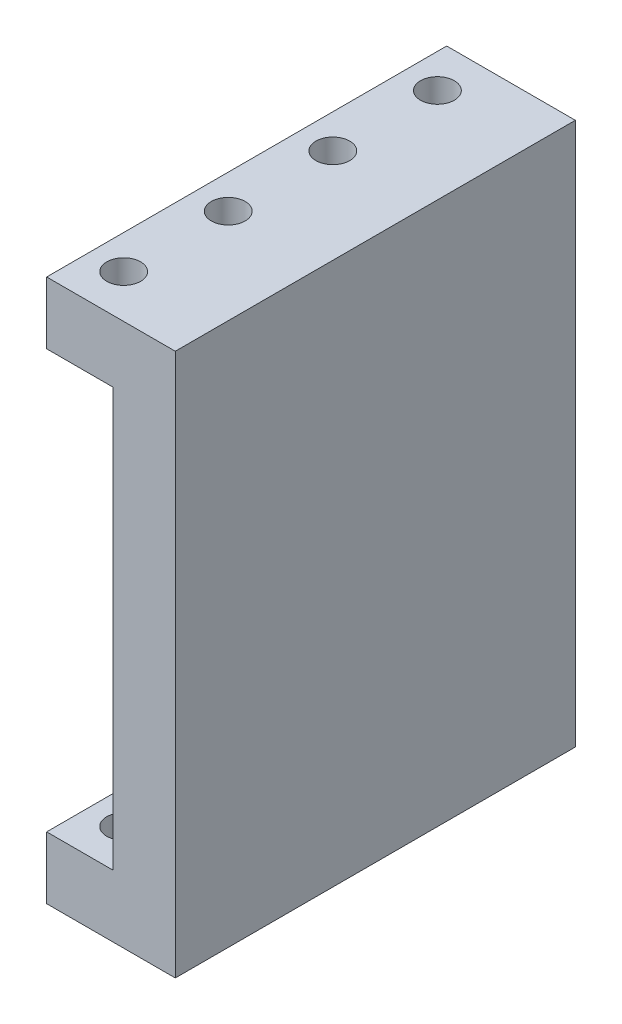
ISO-10303-21;
HEADER;
FILE_DESCRIPTION(('STEP AP214'),'2;1');
FILE_NAME('part.step','',(''),(''),'','','');
FILE_SCHEMA(('AUTOMOTIVE_DESIGN { 1 0 10303 214 1 1 1 1 }'));
ENDSEC;
DATA;
#1=APPLICATION_CONTEXT('core data for automotive mechanical design processes');
#2=APPLICATION_PROTOCOL_DEFINITION('international standard','automotive_design',2000,#1);
#3=PRODUCT_CONTEXT('',#1,'mechanical');
#4=PRODUCT('Part','Part','',(#3));
#5=PRODUCT_RELATED_PRODUCT_CATEGORY('part','',(#4));
#6=PRODUCT_DEFINITION_FORMATION('','',#4);
#7=PRODUCT_DEFINITION_CONTEXT('part definition',#1,'design');
#8=PRODUCT_DEFINITION('design','',#6,#7);
#9=PRODUCT_DEFINITION_SHAPE('','',#8);
#10=(LENGTH_UNIT() NAMED_UNIT(*) SI_UNIT(.MILLI.,.METRE.));
#11=(NAMED_UNIT(*) PLANE_ANGLE_UNIT() SI_UNIT($,.RADIAN.));
#12=(NAMED_UNIT(*) SI_UNIT($,.STERADIAN.) SOLID_ANGLE_UNIT());
#13=UNCERTAINTY_MEASURE_WITH_UNIT(LENGTH_MEASURE(1.E-05),#10,'distance_accuracy_value','');
#14=(GEOMETRIC_REPRESENTATION_CONTEXT(3) GLOBAL_UNCERTAINTY_ASSIGNED_CONTEXT((#13)) GLOBAL_UNIT_ASSIGNED_CONTEXT((#10,
#11,#12)) REPRESENTATION_CONTEXT('',''));
#15=CARTESIAN_POINT('',(0.,0.,0.));
#16=DIRECTION('',(0.,0.,1.));
#17=DIRECTION('',(1.,0.,0.));
#18=AXIS2_PLACEMENT_3D('',#15,#16,#17);
#19=CARTESIAN_POINT('',(5.08,0.,30.607));
#20=DIRECTION('',(-1.,0.,0.));
#21=DIRECTION('',(0.,-1.,0.));
#22=AXIS2_PLACEMENT_3D('',#19,#20,#21);
#23=PLANE('',#22);
#24=DIRECTION('',(0.,1.,0.));
#25=VECTOR('',#24,1.);
#26=CARTESIAN_POINT('',(5.08,0.,0.));
#27=LINE('',#26,#25);
#28=CARTESIAN_POINT('',(5.08,-41.529,0.));
#29=VERTEX_POINT('',#28);
#30=CARTESIAN_POINT('',(5.08,0.,0.));
#31=VERTEX_POINT('',#30);
#32=EDGE_CURVE('E130',#29,#31,#27,.T.);
#33=ORIENTED_EDGE('',*,*,#32,.T.);
#34=DIRECTION('',(0.,0.,-1.));
#35=VECTOR('',#34,1.);
#36=CARTESIAN_POINT('',(5.08,0.,30.607));
#37=LINE('',#36,#35);
#38=CARTESIAN_POINT('',(5.08,0.,30.607));
#39=VERTEX_POINT('',#38);
#40=EDGE_CURVE('E11',#39,#31,#37,.T.);
#41=ORIENTED_EDGE('',*,*,#40,.F.);
#42=DIRECTION('',(0.,1.,0.));
#43=VECTOR('',#42,1.);
#44=CARTESIAN_POINT('',(5.08,0.,30.607));
#45=LINE('',#44,#43);
#46=CARTESIAN_POINT('',(5.08,-41.529,30.607));
#47=VERTEX_POINT('',#46);
#48=EDGE_CURVE('E145',#47,#39,#45,.T.);
#49=ORIENTED_EDGE('',*,*,#48,.F.);
#50=DIRECTION('',(0.,0.,-1.));
#51=VECTOR('',#50,1.);
#52=CARTESIAN_POINT('',(5.08,-41.529,30.607));
#53=LINE('',#52,#51);
#54=EDGE_CURVE('E126',#47,#29,#53,.T.);
#55=ORIENTED_EDGE('',*,*,#54,.T.);
#56=EDGE_LOOP('',(#33,#41,#49,#55));
#57=FACE_BOUND('',#56,.T.);
#58=ADVANCED_FACE('F34',(#57),#23,.F.);
#59=CARTESIAN_POINT('',(-4.7625,0.,30.607));
#60=DIRECTION('',(0.,-1.,0.));
#61=DIRECTION('',(0.,0.,-1.));
#62=AXIS2_PLACEMENT_3D('',#59,#60,#61);
#63=PLANE('',#62);
#64=CARTESIAN_POINT('',(-2.1717,0.,11.303));
#65=DIRECTION('',(0.,1.,0.));
#66=DIRECTION('',(0.,0.,-1.));
#67=AXIS2_PLACEMENT_3D('',#64,#65,#66);
#68=CIRCLE('',#67,1.2954);
#69=CARTESIAN_POINT('',(-2.1717,0.,10.0076));
#70=VERTEX_POINT('',#69);
#71=EDGE_CURVE('E220',#70,#70,#68,.T.);
#72=ORIENTED_EDGE('',*,*,#71,.F.);
#73=EDGE_LOOP('',(#72));
#74=FACE_BOUND('',#73,.T.);
#75=CARTESIAN_POINT('',(-2.1717,0.,3.302));
#76=DIRECTION('',(0.,1.,0.));
#77=DIRECTION('',(0.,0.,-1.));
#78=AXIS2_PLACEMENT_3D('',#75,#76,#77);
#79=CIRCLE('',#78,1.2954);
#80=CARTESIAN_POINT('',(-2.1717,0.,2.0066));
#81=VERTEX_POINT('',#80);
#82=EDGE_CURVE('E208',#81,#81,#79,.T.);
#83=ORIENTED_EDGE('',*,*,#82,.F.);
#84=EDGE_LOOP('',(#83));
#85=FACE_BOUND('',#84,.T.);
#86=CARTESIAN_POINT('',(-2.1717,0.,19.304));
#87=DIRECTION('',(0.,1.,0.));
#88=DIRECTION('',(0.,0.,1.));
#89=AXIS2_PLACEMENT_3D('',#86,#87,#88);
#90=CIRCLE('',#89,1.2954);
#91=CARTESIAN_POINT('',(-2.1717,0.,20.5994));
#92=VERTEX_POINT('',#91);
#93=EDGE_CURVE('E196',#92,#92,#90,.T.);
#94=ORIENTED_EDGE('',*,*,#93,.F.);
#95=EDGE_LOOP('',(#94));
#96=FACE_BOUND('',#95,.T.);
#97=CARTESIAN_POINT('',(-2.1717,0.,27.305));
#98=DIRECTION('',(0.,1.,0.));
#99=DIRECTION('',(0.,0.,1.));
#100=AXIS2_PLACEMENT_3D('',#97,#98,#99);
#101=CIRCLE('',#100,1.2954);
#102=CARTESIAN_POINT('',(-2.1717,0.,28.6004));
#103=VERTEX_POINT('',#102);
#104=EDGE_CURVE('E184',#103,#103,#101,.T.);
#105=ORIENTED_EDGE('',*,*,#104,.F.);
#106=EDGE_LOOP('',(#105));
#107=FACE_BOUND('',#106,.T.);
#108=DIRECTION('',(-1.,0.,0.));
#109=VECTOR('',#108,1.);
#110=CARTESIAN_POINT('',(-4.7625,0.,0.));
#111=LINE('',#110,#109);
#112=CARTESIAN_POINT('',(-4.7625,0.,0.));
#113=VERTEX_POINT('',#112);
#114=EDGE_CURVE('E133',#31,#113,#111,.T.);
#115=ORIENTED_EDGE('',*,*,#114,.T.);
#116=DIRECTION('',(0.,0.,-1.));
#117=VECTOR('',#116,1.);
#118=CARTESIAN_POINT('',(-4.7625,0.,30.607));
#119=LINE('',#118,#117);
#120=CARTESIAN_POINT('',(-4.7625,0.,30.607));
#121=VERTEX_POINT('',#120);
#122=EDGE_CURVE('E42',#121,#113,#119,.T.);
#123=ORIENTED_EDGE('',*,*,#122,.F.);
#124=DIRECTION('',(-1.,0.,0.));
#125=VECTOR('',#124,1.);
#126=CARTESIAN_POINT('',(-4.7625,0.,30.607));
#127=LINE('',#126,#125);
#128=EDGE_CURVE('E93',#39,#121,#127,.T.);
#129=ORIENTED_EDGE('',*,*,#128,.F.);
#130=ORIENTED_EDGE('',*,*,#40,.T.);
#131=EDGE_LOOP('',(#115,#123,#129,#130));
#132=FACE_BOUND('',#131,.T.);
#133=ADVANCED_FACE('F262',(#74,#85,#96,#107,#132),#63,.F.);
#134=CARTESIAN_POINT('',(-4.7625,-4.7625,30.607));
#135=DIRECTION('',(1.,0.,0.));
#136=DIRECTION('',(0.,0.,-1.));
#137=AXIS2_PLACEMENT_3D('',#134,#135,#136);
#138=PLANE('',#137);
#139=DIRECTION('',(0.,-1.,0.));
#140=VECTOR('',#139,1.);
#141=CARTESIAN_POINT('',(-4.7625,-4.7625,0.));
#142=LINE('',#141,#140);
#143=CARTESIAN_POINT('',(-4.7625,-4.7625,0.));
#144=VERTEX_POINT('',#143);
#145=EDGE_CURVE('E136',#113,#144,#142,.T.);
#146=ORIENTED_EDGE('',*,*,#145,.T.);
#147=DIRECTION('',(0.,0.,-1.));
#148=VECTOR('',#147,1.);
#149=CARTESIAN_POINT('',(-4.7625,-4.7625,30.607));
#150=LINE('',#149,#148);
#151=CARTESIAN_POINT('',(-4.7625,-4.7625,30.607));
#152=VERTEX_POINT('',#151);
#153=EDGE_CURVE('E152',#152,#144,#150,.T.);
#154=ORIENTED_EDGE('',*,*,#153,.F.);
#155=DIRECTION('',(0.,-1.,0.));
#156=VECTOR('',#155,1.);
#157=CARTESIAN_POINT('',(-4.7625,-4.7625,30.607));
#158=LINE('',#157,#156);
#159=EDGE_CURVE('E160',#121,#152,#158,.T.);
#160=ORIENTED_EDGE('',*,*,#159,.F.);
#161=ORIENTED_EDGE('',*,*,#122,.T.);
#162=EDGE_LOOP('',(#146,#154,#160,#161));
#163=FACE_BOUND('',#162,.T.);
#164=ADVANCED_FACE('F158',(#163),#138,.F.);
#165=CARTESIAN_POINT('',(0.317500000000004,-4.7625,30.607));
#166=DIRECTION('',(0.,1.,0.));
#167=DIRECTION('',(0.,0.,1.));
#168=AXIS2_PLACEMENT_3D('',#165,#166,#167);
#169=PLANE('',#168);
#170=CARTESIAN_POINT('',(-2.1717,-4.7625,11.303));
#171=DIRECTION('',(0.,1.,0.));
#172=DIRECTION('',(0.,0.,1.));
#173=AXIS2_PLACEMENT_3D('',#170,#171,#172);
#174=CIRCLE('',#173,1.2954);
#175=CARTESIAN_POINT('',(-2.1717,-4.7625,12.5984));
#176=VERTEX_POINT('',#175);
#177=EDGE_CURVE('E211',#176,#176,#174,.T.);
#178=ORIENTED_EDGE('',*,*,#177,.T.);
#179=EDGE_LOOP('',(#178));
#180=FACE_BOUND('',#179,.T.);
#181=CARTESIAN_POINT('',(-2.1717,-4.7625,3.302));
#182=DIRECTION('',(0.,1.,0.));
#183=DIRECTION('',(0.,0.,1.));
#184=AXIS2_PLACEMENT_3D('',#181,#182,#183);
#185=CIRCLE('',#184,1.2954);
#186=CARTESIAN_POINT('',(-2.1717,-4.7625,4.5974));
#187=VERTEX_POINT('',#186);
#188=EDGE_CURVE('E199',#187,#187,#185,.T.);
#189=ORIENTED_EDGE('',*,*,#188,.T.);
#190=EDGE_LOOP('',(#189));
#191=FACE_BOUND('',#190,.T.);
#192=CARTESIAN_POINT('',(-2.1717,-4.7625,19.304));
#193=DIRECTION('',(0.,1.,0.));
#194=DIRECTION('',(0.,0.,1.));
#195=AXIS2_PLACEMENT_3D('',#192,#193,#194);
#196=CIRCLE('',#195,1.2954);
#197=CARTESIAN_POINT('',(-2.1717,-4.7625,20.5994));
#198=VERTEX_POINT('',#197);
#199=EDGE_CURVE('E187',#198,#198,#196,.T.);
#200=ORIENTED_EDGE('',*,*,#199,.T.);
#201=EDGE_LOOP('',(#200));
#202=FACE_BOUND('',#201,.T.);
#203=CARTESIAN_POINT('',(-2.1717,-4.7625,27.305));
#204=DIRECTION('',(0.,1.,0.));
#205=DIRECTION('',(0.,0.,1.));
#206=AXIS2_PLACEMENT_3D('',#203,#204,#205);
#207=CIRCLE('',#206,1.2954);
#208=CARTESIAN_POINT('',(-2.1717,-4.7625,28.6004));
#209=VERTEX_POINT('',#208);
#210=EDGE_CURVE('E134',#209,#209,#207,.T.);
#211=ORIENTED_EDGE('',*,*,#210,.T.);
#212=EDGE_LOOP('',(#211));
#213=FACE_BOUND('',#212,.T.);
#214=DIRECTION('',(1.,0.,0.));
#215=VECTOR('',#214,1.);
#216=CARTESIAN_POINT('',(0.317500000000004,-4.7625,0.));
#217=LINE('',#216,#215);
#218=CARTESIAN_POINT('',(0.317500000000004,-4.7625,0.));
#219=VERTEX_POINT('',#218);
#220=EDGE_CURVE('E138',#144,#219,#217,.T.);
#221=ORIENTED_EDGE('',*,*,#220,.T.);
#222=DIRECTION('',(0.,0.,-1.));
#223=VECTOR('',#222,1.);
#224=CARTESIAN_POINT('',(0.317500000000004,-4.7625,30.607));
#225=LINE('',#224,#223);
#226=CARTESIAN_POINT('',(0.317500000000004,-4.7625,30.607));
#227=VERTEX_POINT('',#226);
#228=EDGE_CURVE('E149',#227,#219,#225,.T.);
#229=ORIENTED_EDGE('',*,*,#228,.F.);
#230=DIRECTION('',(1.,0.,0.));
#231=VECTOR('',#230,1.);
#232=CARTESIAN_POINT('',(0.317500000000004,-4.7625,30.607));
#233=LINE('',#232,#231);
#234=EDGE_CURVE('E172',#152,#227,#233,.T.);
#235=ORIENTED_EDGE('',*,*,#234,.F.);
#236=ORIENTED_EDGE('',*,*,#153,.T.);
#237=EDGE_LOOP('',(#221,#229,#235,#236));
#238=FACE_BOUND('',#237,.T.);
#239=ADVANCED_FACE('F168',(#180,#191,#202,#213,#238),#169,.F.);
#240=CARTESIAN_POINT('',(0.317500000000004,-36.7665,30.607));
#241=DIRECTION('',(1.,0.,0.));
#242=DIRECTION('',(0.,0.,-1.));
#243=AXIS2_PLACEMENT_3D('',#240,#241,#242);
#244=PLANE('',#243);
#245=DIRECTION('',(0.,-1.,0.));
#246=VECTOR('',#245,1.);
#247=CARTESIAN_POINT('',(0.317500000000004,-36.7665,0.));
#248=LINE('',#247,#246);
#249=CARTESIAN_POINT('',(0.317500000000004,-36.7665,0.));
#250=VERTEX_POINT('',#249);
#251=EDGE_CURVE('E140',#219,#250,#248,.T.);
#252=ORIENTED_EDGE('',*,*,#251,.T.);
#253=DIRECTION('',(0.,0.,-1.));
#254=VECTOR('',#253,1.);
#255=CARTESIAN_POINT('',(0.317500000000004,-36.7665,30.607));
#256=LINE('',#255,#254);
#257=CARTESIAN_POINT('',(0.317500000000004,-36.7665,30.607));
#258=VERTEX_POINT('',#257);
#259=EDGE_CURVE('E121',#258,#250,#256,.T.);
#260=ORIENTED_EDGE('',*,*,#259,.F.);
#261=DIRECTION('',(0.,-1.,0.));
#262=VECTOR('',#261,1.);
#263=CARTESIAN_POINT('',(0.317500000000004,-36.7665,30.607));
#264=LINE('',#263,#262);
#265=EDGE_CURVE('E112',#227,#258,#264,.T.);
#266=ORIENTED_EDGE('',*,*,#265,.F.);
#267=ORIENTED_EDGE('',*,*,#228,.T.);
#268=EDGE_LOOP('',(#252,#260,#266,#267));
#269=FACE_BOUND('',#268,.T.);
#270=ADVANCED_FACE('F171',(#269),#244,.F.);
#271=CARTESIAN_POINT('',(-4.7625,-36.7665,30.607));
#272=DIRECTION('',(0.,-1.,0.));
#273=DIRECTION('',(0.,0.,-1.));
#274=AXIS2_PLACEMENT_3D('',#271,#272,#273);
#275=PLANE('',#274);
#276=CARTESIAN_POINT('',(-2.1717,-36.7665,11.303));
#277=DIRECTION('',(0.,-1.,0.));
#278=DIRECTION('',(0.,0.,-1.));
#279=AXIS2_PLACEMENT_3D('',#276,#277,#278);
#280=CIRCLE('',#279,1.2954);
#281=CARTESIAN_POINT('',(-2.1717,-36.7665,10.0076));
#282=VERTEX_POINT('',#281);
#283=EDGE_CURVE('E216',#282,#282,#280,.T.);
#284=ORIENTED_EDGE('',*,*,#283,.T.);
#285=EDGE_LOOP('',(#284));
#286=FACE_BOUND('',#285,.T.);
#287=CARTESIAN_POINT('',(-2.1717,-36.7665,3.302));
#288=DIRECTION('',(0.,-1.,0.));
#289=DIRECTION('',(0.,0.,-1.));
#290=AXIS2_PLACEMENT_3D('',#287,#288,#289);
#291=CIRCLE('',#290,1.2954);
#292=CARTESIAN_POINT('',(-2.1717,-36.7665,2.0066));
#293=VERTEX_POINT('',#292);
#294=EDGE_CURVE('E204',#293,#293,#291,.T.);
#295=ORIENTED_EDGE('',*,*,#294,.T.);
#296=EDGE_LOOP('',(#295));
#297=FACE_BOUND('',#296,.T.);
#298=CARTESIAN_POINT('',(-2.1717,-36.7665,19.304));
#299=DIRECTION('',(0.,-1.,0.));
#300=DIRECTION('',(0.,0.,-1.));
#301=AXIS2_PLACEMENT_3D('',#298,#299,#300);
#302=CIRCLE('',#301,1.2954);
#303=CARTESIAN_POINT('',(-2.1717,-36.7665,18.0086));
#304=VERTEX_POINT('',#303);
#305=EDGE_CURVE('E192',#304,#304,#302,.T.);
#306=ORIENTED_EDGE('',*,*,#305,.T.);
#307=EDGE_LOOP('',(#306));
#308=FACE_BOUND('',#307,.T.);
#309=CARTESIAN_POINT('',(-2.1717,-36.7665,27.305));
#310=DIRECTION('',(0.,-1.,0.));
#311=DIRECTION('',(0.,0.,-1.));
#312=AXIS2_PLACEMENT_3D('',#309,#310,#311);
#313=CIRCLE('',#312,1.2954);
#314=CARTESIAN_POINT('',(-2.1717,-36.7665,26.0096));
#315=VERTEX_POINT('',#314);
#316=EDGE_CURVE('E180',#315,#315,#313,.T.);
#317=ORIENTED_EDGE('',*,*,#316,.T.);
#318=EDGE_LOOP('',(#317));
#319=FACE_BOUND('',#318,.T.);
#320=DIRECTION('',(-1.,0.,0.));
#321=VECTOR('',#320,1.);
#322=CARTESIAN_POINT('',(-4.7625,-36.7665,0.));
#323=LINE('',#322,#321);
#324=CARTESIAN_POINT('',(-4.7625,-36.7665,0.));
#325=VERTEX_POINT('',#324);
#326=EDGE_CURVE('E120',#250,#325,#323,.T.);
#327=ORIENTED_EDGE('',*,*,#326,.T.);
#328=DIRECTION('',(0.,0.,-1.));
#329=VECTOR('',#328,1.);
#330=CARTESIAN_POINT('',(-4.7625,-36.7665,30.607));
#331=LINE('',#330,#329);
#332=CARTESIAN_POINT('',(-4.7625,-36.7665,30.607));
#333=VERTEX_POINT('',#332);
#334=EDGE_CURVE('E117',#333,#325,#331,.T.);
#335=ORIENTED_EDGE('',*,*,#334,.F.);
#336=DIRECTION('',(-1.,0.,0.));
#337=VECTOR('',#336,1.);
#338=CARTESIAN_POINT('',(-4.7625,-36.7665,30.607));
#339=LINE('',#338,#337);
#340=EDGE_CURVE('E106',#258,#333,#339,.T.);
#341=ORIENTED_EDGE('',*,*,#340,.F.);
#342=ORIENTED_EDGE('',*,*,#259,.T.);
#343=EDGE_LOOP('',(#327,#335,#341,#342));
#344=FACE_BOUND('',#343,.T.);
#345=ADVANCED_FACE('F118',(#286,#297,#308,#319,#344),#275,.F.);
#346=CARTESIAN_POINT('',(-4.7625,-41.529,30.607));
#347=DIRECTION('',(1.,0.,0.));
#348=DIRECTION('',(0.,0.,-1.));
#349=AXIS2_PLACEMENT_3D('',#346,#347,#348);
#350=PLANE('',#349);
#351=DIRECTION('',(0.,-1.,0.));
#352=VECTOR('',#351,1.);
#353=CARTESIAN_POINT('',(-4.7625,-41.529,0.));
#354=LINE('',#353,#352);
#355=CARTESIAN_POINT('',(-4.7625,-41.529,0.));
#356=VERTEX_POINT('',#355);
#357=EDGE_CURVE('E79',#325,#356,#354,.T.);
#358=ORIENTED_EDGE('',*,*,#357,.T.);
#359=DIRECTION('',(0.,0.,-1.));
#360=VECTOR('',#359,1.);
#361=CARTESIAN_POINT('',(-4.7625,-41.529,30.607));
#362=LINE('',#361,#360);
#363=CARTESIAN_POINT('',(-4.7625,-41.529,30.607));
#364=VERTEX_POINT('',#363);
#365=EDGE_CURVE('E122',#364,#356,#362,.T.);
#366=ORIENTED_EDGE('',*,*,#365,.F.);
#367=DIRECTION('',(0.,-1.,0.));
#368=VECTOR('',#367,1.);
#369=CARTESIAN_POINT('',(-4.7625,-41.529,30.607));
#370=LINE('',#369,#368);
#371=EDGE_CURVE('E110',#333,#364,#370,.T.);
#372=ORIENTED_EDGE('',*,*,#371,.F.);
#373=ORIENTED_EDGE('',*,*,#334,.T.);
#374=EDGE_LOOP('',(#358,#366,#372,#373));
#375=FACE_BOUND('',#374,.T.);
#376=ADVANCED_FACE('F124',(#375),#350,.F.);
#377=CARTESIAN_POINT('',(5.08,-41.529,30.607));
#378=DIRECTION('',(0.,1.,0.));
#379=DIRECTION('',(0.,0.,1.));
#380=AXIS2_PLACEMENT_3D('',#377,#378,#379);
#381=PLANE('',#380);
#382=CARTESIAN_POINT('',(-2.1717,-41.529,11.303));
#383=DIRECTION('',(0.,1.,0.));
#384=DIRECTION('',(0.,0.,-1.));
#385=AXIS2_PLACEMENT_3D('',#382,#383,#384);
#386=CIRCLE('',#385,1.2954);
#387=CARTESIAN_POINT('',(-2.1717,-41.529,10.0076));
#388=VERTEX_POINT('',#387);
#389=EDGE_CURVE('E219',#388,#388,#386,.T.);
#390=ORIENTED_EDGE('',*,*,#389,.T.);
#391=EDGE_LOOP('',(#390));
#392=FACE_BOUND('',#391,.T.);
#393=CARTESIAN_POINT('',(-2.1717,-41.529,3.302));
#394=DIRECTION('',(0.,1.,0.));
#395=DIRECTION('',(0.,0.,-1.));
#396=AXIS2_PLACEMENT_3D('',#393,#394,#395);
#397=CIRCLE('',#396,1.2954);
#398=CARTESIAN_POINT('',(-2.1717,-41.529,2.0066));
#399=VERTEX_POINT('',#398);
#400=EDGE_CURVE('E207',#399,#399,#397,.T.);
#401=ORIENTED_EDGE('',*,*,#400,.T.);
#402=EDGE_LOOP('',(#401));
#403=FACE_BOUND('',#402,.T.);
#404=CARTESIAN_POINT('',(-2.1717,-41.529,19.304));
#405=DIRECTION('',(0.,1.,0.));
#406=DIRECTION('',(0.,0.,1.));
#407=AXIS2_PLACEMENT_3D('',#404,#405,#406);
#408=CIRCLE('',#407,1.2954);
#409=CARTESIAN_POINT('',(-2.1717,-41.529,20.5994));
#410=VERTEX_POINT('',#409);
#411=EDGE_CURVE('E195',#410,#410,#408,.T.);
#412=ORIENTED_EDGE('',*,*,#411,.T.);
#413=EDGE_LOOP('',(#412));
#414=FACE_BOUND('',#413,.T.);
#415=CARTESIAN_POINT('',(-2.1717,-41.529,27.305));
#416=DIRECTION('',(0.,1.,0.));
#417=DIRECTION('',(0.,0.,1.));
#418=AXIS2_PLACEMENT_3D('',#415,#416,#417);
#419=CIRCLE('',#418,1.2954);
#420=CARTESIAN_POINT('',(-2.1717,-41.529,28.6004));
#421=VERTEX_POINT('',#420);
#422=EDGE_CURVE('E183',#421,#421,#419,.T.);
#423=ORIENTED_EDGE('',*,*,#422,.T.);
#424=EDGE_LOOP('',(#423));
#425=FACE_BOUND('',#424,.T.);
#426=DIRECTION('',(1.,0.,0.));
#427=VECTOR('',#426,1.);
#428=CARTESIAN_POINT('',(5.08,-41.529,0.));
#429=LINE('',#428,#427);
#430=EDGE_CURVE('E85',#356,#29,#429,.T.);
#431=ORIENTED_EDGE('',*,*,#430,.T.);
#432=ORIENTED_EDGE('',*,*,#54,.F.);
#433=DIRECTION('',(1.,0.,0.));
#434=VECTOR('',#433,1.);
#435=CARTESIAN_POINT('',(5.08,-41.529,30.607));
#436=LINE('',#435,#434);
#437=EDGE_CURVE('E50',#364,#47,#436,.T.);
#438=ORIENTED_EDGE('',*,*,#437,.F.);
#439=ORIENTED_EDGE('',*,*,#365,.T.);
#440=EDGE_LOOP('',(#431,#432,#438,#439));
#441=FACE_BOUND('',#440,.T.);
#442=ADVANCED_FACE('F226',(#392,#403,#414,#425,#441),#381,.F.);
#443=CARTESIAN_POINT('',(0.,0.,30.607));
#444=DIRECTION('',(0.,0.,-1.));
#445=DIRECTION('',(-1.,0.,0.));
#446=AXIS2_PLACEMENT_3D('',#443,#444,#445);
#447=PLANE('',#446);
#448=ORIENTED_EDGE('',*,*,#48,.T.);
#449=ORIENTED_EDGE('',*,*,#128,.T.);
#450=ORIENTED_EDGE('',*,*,#159,.T.);
#451=ORIENTED_EDGE('',*,*,#234,.T.);
#452=ORIENTED_EDGE('',*,*,#265,.T.);
#453=ORIENTED_EDGE('',*,*,#340,.T.);
#454=ORIENTED_EDGE('',*,*,#371,.T.);
#455=ORIENTED_EDGE('',*,*,#437,.T.);
#456=EDGE_LOOP('',(#448,#449,#450,#451,#452,#453,#454,#455));
#457=FACE_BOUND('',#456,.T.);
#458=ADVANCED_FACE('F108',(#457),#447,.F.);
#459=CARTESIAN_POINT('',(0.,0.,0.));
#460=DIRECTION('',(0.,0.,-1.));
#461=DIRECTION('',(-1.,0.,0.));
#462=AXIS2_PLACEMENT_3D('',#459,#460,#461);
#463=PLANE('',#462);
#464=ORIENTED_EDGE('',*,*,#32,.F.);
#465=ORIENTED_EDGE('',*,*,#430,.F.);
#466=ORIENTED_EDGE('',*,*,#357,.F.);
#467=ORIENTED_EDGE('',*,*,#326,.F.);
#468=ORIENTED_EDGE('',*,*,#251,.F.);
#469=ORIENTED_EDGE('',*,*,#220,.F.);
#470=ORIENTED_EDGE('',*,*,#145,.F.);
#471=ORIENTED_EDGE('',*,*,#114,.F.);
#472=EDGE_LOOP('',(#464,#465,#466,#467,#468,#469,#470,#471));
#473=FACE_BOUND('',#472,.T.);
#474=ADVANCED_FACE('F164',(#473),#463,.T.);
#475=CARTESIAN_POINT('',(-2.1717,-41.529,27.305));
#476=DIRECTION('',(0.,1.,0.));
#477=DIRECTION('',(0.,0.,1.));
#478=AXIS2_PLACEMENT_3D('',#475,#476,#477);
#479=CYLINDRICAL_SURFACE('',#478,1.2954);
#480=ORIENTED_EDGE('',*,*,#422,.F.);
#481=EDGE_LOOP('',(#480));
#482=FACE_BOUND('',#481,.T.);
#483=ORIENTED_EDGE('',*,*,#316,.F.);
#484=EDGE_LOOP('',(#483));
#485=FACE_BOUND('',#484,.T.);
#486=ADVANCED_FACE('F246',(#482,#485),#479,.F.);
#487=ORIENTED_EDGE('',*,*,#104,.T.);
#488=EDGE_LOOP('',(#487));
#489=FACE_BOUND('',#488,.T.);
#490=ORIENTED_EDGE('',*,*,#210,.F.);
#491=EDGE_LOOP('',(#490));
#492=FACE_BOUND('',#491,.T.);
#493=ADVANCED_FACE('F248',(#489,#492),#479,.F.);
#494=CARTESIAN_POINT('',(-2.1717,-41.529,19.304));
#495=DIRECTION('',(0.,1.,0.));
#496=DIRECTION('',(0.,0.,1.));
#497=AXIS2_PLACEMENT_3D('',#494,#495,#496);
#498=CYLINDRICAL_SURFACE('',#497,1.2954);
#499=ORIENTED_EDGE('',*,*,#411,.F.);
#500=EDGE_LOOP('',(#499));
#501=FACE_BOUND('',#500,.T.);
#502=ORIENTED_EDGE('',*,*,#305,.F.);
#503=EDGE_LOOP('',(#502));
#504=FACE_BOUND('',#503,.T.);
#505=ADVANCED_FACE('F255',(#501,#504),#498,.F.);
#506=ORIENTED_EDGE('',*,*,#93,.T.);
#507=EDGE_LOOP('',(#506));
#508=FACE_BOUND('',#507,.T.);
#509=ORIENTED_EDGE('',*,*,#199,.F.);
#510=EDGE_LOOP('',(#509));
#511=FACE_BOUND('',#510,.T.);
#512=ADVANCED_FACE('F352',(#508,#511),#498,.F.);
#513=CARTESIAN_POINT('',(-2.1717,-41.529,3.302));
#514=DIRECTION('',(0.,1.,0.));
#515=DIRECTION('',(0.,0.,1.));
#516=AXIS2_PLACEMENT_3D('',#513,#514,#515);
#517=CYLINDRICAL_SURFACE('',#516,1.2954);
#518=ORIENTED_EDGE('',*,*,#400,.F.);
#519=EDGE_LOOP('',(#518));
#520=FACE_BOUND('',#519,.T.);
#521=ORIENTED_EDGE('',*,*,#294,.F.);
#522=EDGE_LOOP('',(#521));
#523=FACE_BOUND('',#522,.T.);
#524=ADVANCED_FACE('F360',(#520,#523),#517,.F.);
#525=ORIENTED_EDGE('',*,*,#82,.T.);
#526=EDGE_LOOP('',(#525));
#527=FACE_BOUND('',#526,.T.);
#528=ORIENTED_EDGE('',*,*,#188,.F.);
#529=EDGE_LOOP('',(#528));
#530=FACE_BOUND('',#529,.T.);
#531=ADVANCED_FACE('F233',(#527,#530),#517,.F.);
#532=CARTESIAN_POINT('',(-2.1717,-41.529,11.303));
#533=DIRECTION('',(0.,1.,0.));
#534=DIRECTION('',(0.,0.,1.));
#535=AXIS2_PLACEMENT_3D('',#532,#533,#534);
#536=CYLINDRICAL_SURFACE('',#535,1.2954);
#537=ORIENTED_EDGE('',*,*,#389,.F.);
#538=EDGE_LOOP('',(#537));
#539=FACE_BOUND('',#538,.T.);
#540=ORIENTED_EDGE('',*,*,#283,.F.);
#541=EDGE_LOOP('',(#540));
#542=FACE_BOUND('',#541,.T.);
#543=ADVANCED_FACE('F229',(#539,#542),#536,.F.);
#544=ORIENTED_EDGE('',*,*,#71,.T.);
#545=EDGE_LOOP('',(#544));
#546=FACE_BOUND('',#545,.T.);
#547=ORIENTED_EDGE('',*,*,#177,.F.);
#548=EDGE_LOOP('',(#547));
#549=FACE_BOUND('',#548,.T.);
#550=ADVANCED_FACE('F232',(#546,#549),#536,.F.);
#551=CLOSED_SHELL('',(#58,#133,#164,#239,#270,#345,#376,#442,#458,#474,#486,#493,#505,#512,#524,
#531,#543,#550));
#552=MANIFOLD_SOLID_BREP('B2',#551);
#553=ADVANCED_BREP_SHAPE_REPRESENTATION('',(#18,#552),#14);
#554=SHAPE_DEFINITION_REPRESENTATION(#9,#553);
ENDSEC;
END-ISO-10303-21;
